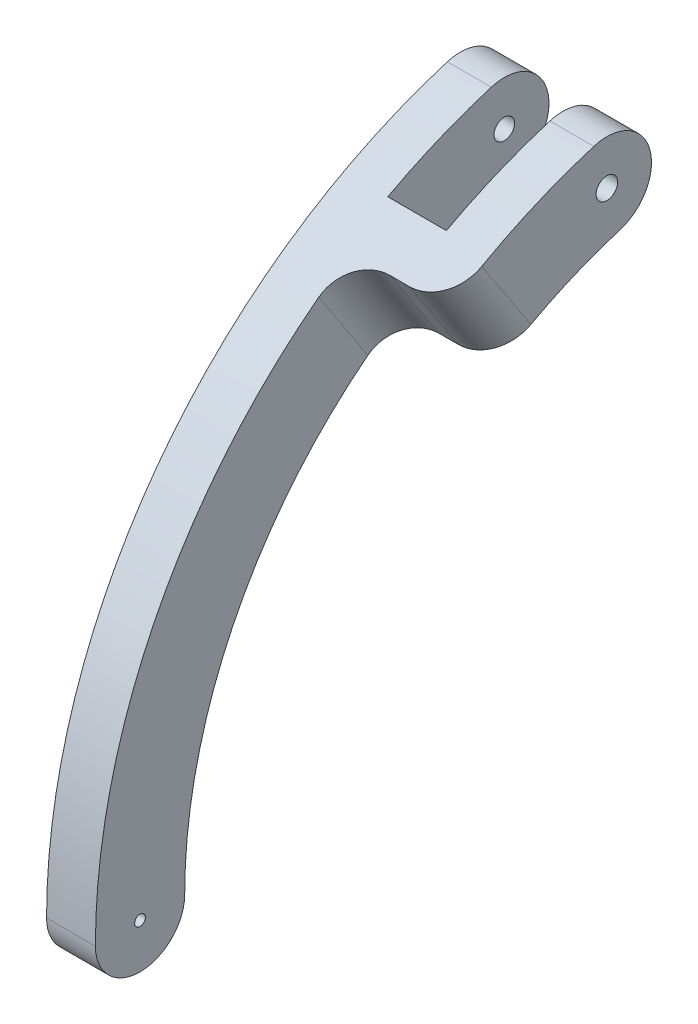
ISO-10303-21;
HEADER;
FILE_DESCRIPTION(('STEP AP214'),'2;1');
FILE_NAME('part.step','',(''),(''),'','','');
FILE_SCHEMA(('AUTOMOTIVE_DESIGN { 1 0 10303 214 1 1 1 1 }'));
ENDSEC;
DATA;
#1=APPLICATION_CONTEXT('core data for automotive mechanical design processes');
#2=APPLICATION_PROTOCOL_DEFINITION('international standard','automotive_design',2000,#1);
#3=PRODUCT_CONTEXT('',#1,'mechanical');
#4=PRODUCT('Part','Part','',(#3));
#5=PRODUCT_RELATED_PRODUCT_CATEGORY('part','',(#4));
#6=PRODUCT_DEFINITION_FORMATION('','',#4);
#7=PRODUCT_DEFINITION_CONTEXT('part definition',#1,'design');
#8=PRODUCT_DEFINITION('design','',#6,#7);
#9=PRODUCT_DEFINITION_SHAPE('','',#8);
#10=(LENGTH_UNIT() NAMED_UNIT(*) SI_UNIT(.MILLI.,.METRE.));
#11=(NAMED_UNIT(*) PLANE_ANGLE_UNIT() SI_UNIT($,.RADIAN.));
#12=(NAMED_UNIT(*) SI_UNIT($,.STERADIAN.) SOLID_ANGLE_UNIT());
#13=UNCERTAINTY_MEASURE_WITH_UNIT(LENGTH_MEASURE(1.E-05),#10,'distance_accuracy_value','');
#14=(GEOMETRIC_REPRESENTATION_CONTEXT(3) GLOBAL_UNCERTAINTY_ASSIGNED_CONTEXT((#13)) GLOBAL_UNIT_ASSIGNED_CONTEXT((#10,
#11,#12)) REPRESENTATION_CONTEXT('',''));
#15=CARTESIAN_POINT('',(0.,0.,0.));
#16=DIRECTION('',(0.,0.,1.));
#17=DIRECTION('',(1.,0.,0.));
#18=AXIS2_PLACEMENT_3D('',#15,#16,#17);
#19=CARTESIAN_POINT('',(5.,51.0253857832654,15.542380952381));
#20=DIRECTION('',(-1.,0.,0.));
#21=DIRECTION('',(0.,0.,1.));
#22=AXIS2_PLACEMENT_3D('',#19,#20,#21);
#23=CYLINDRICAL_SURFACE('',#22,4.572);
#24=DIRECTION('',(-1.,0.,0.));
#25=VECTOR('',#24,1.);
#26=CARTESIAN_POINT('',(5.,55.3989902789739,16.8745850340136));
#27=LINE('',#26,#25);
#28=CARTESIAN_POINT('',(4.5,55.3989902789739,16.8745850340136));
#29=VERTEX_POINT('',#28);
#30=CARTESIAN_POINT('',(0.,55.3989902789739,16.8745850340136));
#31=VERTEX_POINT('',#30);
#32=EDGE_CURVE('E210',#29,#31,#27,.T.);
#33=ORIENTED_EDGE('',*,*,#32,.F.);
#34=CARTESIAN_POINT('',(4.5,51.0253857832654,15.542380952381));
#35=DIRECTION('',(-1.,0.,0.));
#36=DIRECTION('',(0.,0.,1.));
#37=AXIS2_PLACEMENT_3D('',#34,#35,#36);
#38=CIRCLE('',#37,4.572);
#39=CARTESIAN_POINT('',(4.5,46.651781287557,14.2101768707483));
#40=VERTEX_POINT('',#39);
#41=EDGE_CURVE('E158',#29,#40,#38,.T.);
#42=ORIENTED_EDGE('',*,*,#41,.T.);
#43=DIRECTION('',(-1.,0.,0.));
#44=VECTOR('',#43,1.);
#45=CARTESIAN_POINT('',(5.,46.651781287557,14.2101768707483));
#46=LINE('',#45,#44);
#47=CARTESIAN_POINT('',(0.,46.651781287557,14.2101768707483));
#48=VERTEX_POINT('',#47);
#49=EDGE_CURVE('E157',#40,#48,#46,.T.);
#50=ORIENTED_EDGE('',*,*,#49,.T.);
#51=CARTESIAN_POINT('',(0.,51.0253857832654,15.542380952381));
#52=DIRECTION('',(1.,0.,0.));
#53=DIRECTION('',(0.,0.,-1.));
#54=AXIS2_PLACEMENT_3D('',#51,#52,#53);
#55=CIRCLE('',#54,4.572);
#56=EDGE_CURVE('E204',#48,#31,#55,.T.);
#57=ORIENTED_EDGE('',*,*,#56,.T.);
#58=EDGE_LOOP('',(#33,#42,#50,#57));
#59=FACE_BOUND('',#58,.T.);
#60=ADVANCED_FACE('F35',(#59),#23,.T.);
#61=CARTESIAN_POINT('',(5.,0.,26.67));
#62=DIRECTION('',(1.,0.,0.));
#63=DIRECTION('',(0.,0.,-1.));
#64=AXIS2_PLACEMENT_3D('',#61,#62,#63);
#65=PLANE('',#64);
#66=CARTESIAN_POINT('',(5.,0.,0.));
#67=DIRECTION('',(-1.,0.,0.));
#68=DIRECTION('',(0.,0.,1.));
#69=AXIS2_PLACEMENT_3D('',#66,#67,#68);
#70=CIRCLE('',#69,48.768);
#71=CARTESIAN_POINT('',(5.,0.,48.768));
#72=VERTEX_POINT('',#71);
#73=CARTESIAN_POINT('',(5.,38.4411023336171,30.0099895930735));
#74=VERTEX_POINT('',#73);
#75=EDGE_CURVE('E193',#72,#74,#70,.T.);
#76=ORIENTED_EDGE('',*,*,#75,.T.);
#77=DIRECTION('',(0.,-0.836061110184684,-0.548636327667749));
#78=VECTOR('',#77,1.);
#79=CARTESIAN_POINT('',(5.,10.0388102595876,11.3719629811189));
#80=LINE('',#79,#78);
#81=CARTESIAN_POINT('',(5.,46.1077936196312,35.0409918742249));
#82=VERTEX_POINT('',#81);
#83=EDGE_CURVE('E233',#74,#82,#80,.F.);
#84=ORIENTED_EDGE('',*,*,#83,.T.);
#85=CARTESIAN_POINT('',(5.,0.,0.));
#86=DIRECTION('',(1.,0.,0.));
#87=DIRECTION('',(0.,0.,1.));
#88=AXIS2_PLACEMENT_3D('',#85,#86,#87);
#89=CIRCLE('',#88,57.912);
#90=CARTESIAN_POINT('',(5.,0.,57.912));
#91=VERTEX_POINT('',#90);
#92=EDGE_CURVE('E197',#82,#91,#89,.T.);
#93=ORIENTED_EDGE('',*,*,#92,.T.);
#94=CARTESIAN_POINT('',(5.,0.,53.34));
#95=DIRECTION('',(1.,0.,0.));
#96=DIRECTION('',(0.,0.,-1.));
#97=AXIS2_PLACEMENT_3D('',#94,#95,#96);
#98=CIRCLE('',#97,4.572);
#99=EDGE_CURVE('E190',#91,#72,#98,.T.);
#100=ORIENTED_EDGE('',*,*,#99,.T.);
#101=EDGE_LOOP('',(#76,#84,#93,#100));
#102=FACE_BOUND('',#101,.T.);
#103=CARTESIAN_POINT('',(5.,0.,53.34));
#104=DIRECTION('',(1.,0.,0.));
#105=DIRECTION('',(0.,0.,-1.));
#106=AXIS2_PLACEMENT_3D('',#103,#104,#105);
#107=CIRCLE('',#106,0.550000000000003);
#108=CARTESIAN_POINT('',(5.,0.,52.79));
#109=VERTEX_POINT('',#108);
#110=EDGE_CURVE('E181',#109,#109,#107,.T.);
#111=ORIENTED_EDGE('',*,*,#110,.F.);
#112=EDGE_LOOP('',(#111));
#113=FACE_BOUND('',#112,.T.);
#114=ADVANCED_FACE('F272',(#102,#113),#65,.T.);
#115=CARTESIAN_POINT('',(0.,0.,26.67));
#116=DIRECTION('',(1.,0.,0.));
#117=DIRECTION('',(0.,0.,-1.));
#118=AXIS2_PLACEMENT_3D('',#115,#116,#117);
#119=PLANE('',#118);
#120=CARTESIAN_POINT('',(0.,0.,53.34));
#121=DIRECTION('',(1.,0.,0.));
#122=DIRECTION('',(0.,0.,-1.));
#123=AXIS2_PLACEMENT_3D('',#120,#121,#122);
#124=CIRCLE('',#123,4.572);
#125=CARTESIAN_POINT('',(0.,0.,57.912));
#126=VERTEX_POINT('',#125);
#127=CARTESIAN_POINT('',(0.,0.,48.768));
#128=VERTEX_POINT('',#127);
#129=EDGE_CURVE('E189',#126,#128,#124,.T.);
#130=ORIENTED_EDGE('',*,*,#129,.F.);
#131=CARTESIAN_POINT('',(0.,0.,0.));
#132=DIRECTION('',(1.,0.,0.));
#133=DIRECTION('',(0.,0.,1.));
#134=AXIS2_PLACEMENT_3D('',#131,#132,#133);
#135=CIRCLE('',#134,57.912);
#136=EDGE_CURVE('E194',#31,#126,#135,.T.);
#137=ORIENTED_EDGE('',*,*,#136,.F.);
#138=ORIENTED_EDGE('',*,*,#56,.F.);
#139=CARTESIAN_POINT('',(0.,0.,0.));
#140=DIRECTION('',(-1.,0.,0.));
#141=DIRECTION('',(0.,0.,1.));
#142=AXIS2_PLACEMENT_3D('',#139,#140,#141);
#143=CIRCLE('',#142,48.768);
#144=EDGE_CURVE('E202',#128,#48,#143,.T.);
#145=ORIENTED_EDGE('',*,*,#144,.F.);
#146=EDGE_LOOP('',(#130,#137,#138,#145));
#147=FACE_BOUND('',#146,.T.);
#148=CARTESIAN_POINT('',(0.,51.0253857832654,15.542380952381));
#149=DIRECTION('',(1.,0.,0.));
#150=DIRECTION('',(0.,0.,-1.));
#151=AXIS2_PLACEMENT_3D('',#148,#149,#150);
#152=CIRCLE('',#151,1.05);
#153=CARTESIAN_POINT('',(0.,51.0253857832654,14.492380952381));
#154=VERTEX_POINT('',#153);
#155=EDGE_CURVE('E184',#154,#154,#152,.T.);
#156=ORIENTED_EDGE('',*,*,#155,.T.);
#157=EDGE_LOOP('',(#156));
#158=FACE_BOUND('',#157,.T.);
#159=CARTESIAN_POINT('',(0.,0.,53.34));
#160=DIRECTION('',(1.,0.,0.));
#161=DIRECTION('',(0.,0.,-1.));
#162=AXIS2_PLACEMENT_3D('',#159,#160,#161);
#163=CIRCLE('',#162,0.550000000000003);
#164=CARTESIAN_POINT('',(0.,0.,52.79));
#165=VERTEX_POINT('',#164);
#166=EDGE_CURVE('E180',#165,#165,#163,.T.);
#167=ORIENTED_EDGE('',*,*,#166,.T.);
#168=EDGE_LOOP('',(#167));
#169=FACE_BOUND('',#168,.T.);
#170=ADVANCED_FACE('F277',(#147,#158,#169),#119,.F.);
#171=CARTESIAN_POINT('',(5.,0.,53.34));
#172=DIRECTION('',(-1.,0.,0.));
#173=DIRECTION('',(0.,0.,1.));
#174=AXIS2_PLACEMENT_3D('',#171,#172,#173);
#175=CYLINDRICAL_SURFACE('',#174,4.572);
#176=ORIENTED_EDGE('',*,*,#129,.T.);
#177=DIRECTION('',(-1.,0.,0.));
#178=VECTOR('',#177,1.);
#179=CARTESIAN_POINT('',(5.,0.,48.768));
#180=LINE('',#179,#178);
#181=EDGE_CURVE('E217',#72,#128,#180,.T.);
#182=ORIENTED_EDGE('',*,*,#181,.F.);
#183=ORIENTED_EDGE('',*,*,#99,.F.);
#184=DIRECTION('',(-1.,0.,0.));
#185=VECTOR('',#184,1.);
#186=CARTESIAN_POINT('',(5.,0.,57.912));
#187=LINE('',#186,#185);
#188=EDGE_CURVE('E199',#91,#126,#187,.T.);
#189=ORIENTED_EDGE('',*,*,#188,.T.);
#190=EDGE_LOOP('',(#176,#182,#183,#189));
#191=FACE_BOUND('',#190,.T.);
#192=ADVANCED_FACE('F252',(#191),#175,.T.);
#193=CARTESIAN_POINT('',(5.,0.,0.));
#194=DIRECTION('',(-1.,0.,0.));
#195=DIRECTION('',(0.,0.,1.));
#196=AXIS2_PLACEMENT_3D('',#193,#194,#195);
#197=CYLINDRICAL_SURFACE('',#196,48.768);
#198=CARTESIAN_POINT('',(15.,0.,0.));
#199=DIRECTION('',(-1.,0.,0.));
#200=DIRECTION('',(0.,0.,-1.));
#201=AXIS2_PLACEMENT_3D('',#198,#199,#200);
#202=CIRCLE('',#201,48.768);
#203=CARTESIAN_POINT('',(15.,42.8301929549591,23.321500711596));
#204=VERTEX_POINT('',#203);
#205=CARTESIAN_POINT('',(15.,46.651781287557,14.2101768707483));
#206=VERTEX_POINT('',#205);
#207=EDGE_CURVE('E172',#204,#206,#202,.T.);
#208=ORIENTED_EDGE('',*,*,#207,.F.);
#209=CARTESIAN_POINT('',(15.,42.8301929549591,23.321500711596));
#210=CARTESIAN_POINT('',(15.0000121815658,42.7764127888601,23.4202767277682));
#211=CARTESIAN_POINT('',(14.9952890331577,42.7222844230492,23.5188626327073));
#212=CARTESIAN_POINT('',(14.9764431928033,42.6137373798137,23.7149671809633));
#213=CARTESIAN_POINT('',(14.9623207454146,42.559318709979,23.8124858519811));
#214=CARTESIAN_POINT('',(14.9247607016469,42.4506327478518,24.0057057629585));
#215=CARTESIAN_POINT('',(14.901329699486,42.3963653757259,24.1014082393398));
#216=CARTESIAN_POINT('',(14.8453102615447,42.2883671251319,24.2904028164442));
#217=CARTESIAN_POINT('',(14.8127220017254,42.2346362363757,24.3836949634453));
#218=CARTESIAN_POINT('',(14.7385919086943,42.128118448252,24.5672694604092));
#219=CARTESIAN_POINT('',(14.697046366619,42.0753319497547,24.6575505456736));
#220=CARTESIAN_POINT('',(14.6052829373853,41.9711439921967,24.8344809113444));
#221=CARTESIAN_POINT('',(14.5550618462363,41.9197430529771,24.9211288352337));
#222=CARTESIAN_POINT('',(14.446333868917,41.81880837762,25.0901329028123));
#223=CARTESIAN_POINT('',(14.3878318015586,41.7692735766287,25.172491504655));
#224=CARTESIAN_POINT('',(14.2629404081728,41.6724651792581,25.3324342888501));
#225=CARTESIAN_POINT('',(14.1965481847884,41.6251924225214,25.4100167013565));
#226=CARTESIAN_POINT('',(13.9865037549123,41.4876069199725,25.6344878980303));
#227=CARTESIAN_POINT('',(13.8316701703922,41.4012355607191,25.7735864060066));
#228=CARTESIAN_POINT('',(13.4967874547993,41.2423734941752,26.0270427257262));
#229=CARTESIAN_POINT('',(13.3167330656486,41.1698856888318,26.1413953657233));
#230=CARTESIAN_POINT('',(12.9362943477481,41.0413763435968,26.3426945197453));
#231=CARTESIAN_POINT('',(12.7358907287593,40.9853706278016,26.429614702222));
#232=CARTESIAN_POINT('',(12.3206250923403,40.8920825254445,26.5737244480186));
#233=CARTESIAN_POINT('',(12.1057713832712,40.8547894822874,26.6309309335112));
#234=CARTESIAN_POINT('',(11.7413783347004,40.809467770877,26.7003044230343));
#235=CARTESIAN_POINT('',(11.5941057344009,40.7958188492692,26.7211426356511));
#236=CARTESIAN_POINT('',(11.2979090454556,40.7775963062787,26.7489353184245));
#237=CARTESIAN_POINT('',(11.1489875421299,40.7730100737746,26.7559090816406));
#238=CARTESIAN_POINT('',(11.,40.7730282214867,26.7558964277008));
#239=B_SPLINE_CURVE_WITH_KNOTS('',3,(#209,#210,#211,#212,#213,#214,#215,#216,#217,#218,#219,
#220,#221,#222,#223,#224,#225,#226,#227,#228,#229,#230,#231,#232,#233,#234,#235,#236,#237,#238),
.UNSPECIFIED.,.F.,.F.,(4,2,2,2,2,2,2,2,2,2,2,2,2,2,4),(0.,0.337303006389539,0.674597236935861,
1.01165295173073,1.34870219028153,1.68589125680822,2.02320511882105,2.36032349417541,
2.69756604806973,3.37013327016325,4.04284091953263,4.71619232956495,5.38915983930082,
5.83638325715429,6.28298390492815),.UNSPECIFIED.);
#240=CARTESIAN_POINT('',(11.,40.7730282214867,26.7558964277008));
#241=VERTEX_POINT('',#240);
#242=EDGE_CURVE('E56',#204,#241,#239,.T.);
#243=ORIENTED_EDGE('',*,*,#242,.T.);
#244=DIRECTION('',(-1.,0.,0.));
#245=VECTOR('',#244,1.);
#246=CARTESIAN_POINT('',(15.,40.7730282214867,26.7558964277008));
#247=LINE('',#246,#245);
#248=CARTESIAN_POINT('',(9.,40.7730282214867,26.7558964277008));
#249=VERTEX_POINT('',#248);
#250=EDGE_CURVE('E174',#241,#249,#247,.T.);
#251=ORIENTED_EDGE('',*,*,#250,.T.);
#252=CARTESIAN_POINT('',(9.,40.7730282214867,26.7558964277008));
#253=CARTESIAN_POINT('',(8.88750101249402,40.7730317096793,26.7558858272302));
#254=CARTESIAN_POINT('',(8.77500713511228,40.7704243466639,26.7598643070856));
#255=CARTESIAN_POINT('',(8.55082411767978,40.7600160369833,26.775718129916));
#256=CARTESIAN_POINT('',(8.43913493951237,40.7522153379706,26.7875930963344));
#257=CARTESIAN_POINT('',(8.21742744147297,40.7314561932013,26.8191468700817));
#258=CARTESIAN_POINT('',(8.1074079406166,40.7185015880605,26.8388198663922));
#259=CARTESIAN_POINT('',(7.88977104553745,40.6875048637736,26.8857872477433));
#260=CARTESIAN_POINT('',(7.78215362199694,40.6694628067572,26.9130815397097));
#261=CARTESIAN_POINT('',(7.46394202035902,40.6077853893746,27.00613301235));
#262=CARTESIAN_POINT('',(7.25789909730264,40.5565904317826,27.0830716264149));
#263=CARTESIAN_POINT('',(6.86440634060854,40.4350900355563,27.2641361317215));
#264=CARTESIAN_POINT('',(6.67695325928813,40.3647879430329,27.3682572625364));
#265=CARTESIAN_POINT('',(6.32582716859217,40.2064630711044,27.6003229087612));
#266=CARTESIAN_POINT('',(6.16214725136029,40.1184454571707,27.7282604789863));
#267=CARTESIAN_POINT('',(5.8631693304621,39.9265174174691,28.0039134816577));
#268=CARTESIAN_POINT('',(5.7278760790381,39.8226043356507,28.15163221892));
#269=CARTESIAN_POINT('',(5.48965473540508,39.6013691560713,28.4620033372705));
#270=CARTESIAN_POINT('',(5.38669463298308,39.4840604780543,28.6246407412128));
#271=CARTESIAN_POINT('',(5.21587512446005,39.2387896166409,28.9599419978752));
#272=CARTESIAN_POINT('',(5.14799679932643,39.1108332187054,29.132600390439));
#273=CARTESIAN_POINT('',(5.06578855642458,38.8920200048178,29.4236253642593));
#274=CARTESIAN_POINT('',(5.04112371099703,38.8031798670384,29.5406956153022));
#275=CARTESIAN_POINT('',(5.00823113872103,38.6234550851084,29.7753013450045));
#276=CARTESIAN_POINT('',(4.99997966558717,38.53257358726,29.8928359046975));
#277=CARTESIAN_POINT('',(5.,38.4411023336171,30.0099895930735));
#278=B_SPLINE_CURVE_WITH_KNOTS('',3,(#252,#253,#254,#255,#256,#257,#258,#259,#260,#261,#262,
#263,#264,#265,#266,#267,#268,#269,#270,#271,#272,#273,#274,#275,#276,#277),.UNSPECIFIED.,.F.,
.F.,(4,2,2,2,2,2,2,2,2,2,2,2,4),(0.,0.337387217395278,0.674758347103189,1.01187854224819,
1.34899462053765,2.02295805769869,2.69680354390322,3.37045283491373,4.04421481245246,
4.71730763905991,5.39003709788675,5.83622991594024,6.28177672715104),.UNSPECIFIED.);
#279=EDGE_CURVE('E49',#249,#74,#278,.T.);
#280=ORIENTED_EDGE('',*,*,#279,.T.);
#281=ORIENTED_EDGE('',*,*,#75,.F.);
#282=ORIENTED_EDGE('',*,*,#181,.T.);
#283=ORIENTED_EDGE('',*,*,#144,.T.);
#284=ORIENTED_EDGE('',*,*,#49,.F.);
#285=CARTESIAN_POINT('',(4.50000000000001,0.,0.));
#286=DIRECTION('',(-1.,0.,0.));
#287=DIRECTION('',(0.,0.,1.));
#288=AXIS2_PLACEMENT_3D('',#285,#286,#287);
#289=CIRCLE('',#288,48.768);
#290=CARTESIAN_POINT('',(4.5,43.3013482124218,22.4345953158642));
#291=VERTEX_POINT('',#290);
#292=EDGE_CURVE('E143',#40,#291,#289,.F.);
#293=ORIENTED_EDGE('',*,*,#292,.T.);
#294=DIRECTION('',(-1.,0.,0.));
#295=VECTOR('',#294,1.);
#296=CARTESIAN_POINT('',(5.,43.3013482124218,22.4345953158642));
#297=LINE('',#296,#295);
#298=CARTESIAN_POINT('',(10.5,43.3013482124218,22.4345953158642));
#299=VERTEX_POINT('',#298);
#300=EDGE_CURVE('E132',#291,#299,#297,.F.);
#301=ORIENTED_EDGE('',*,*,#300,.T.);
#302=CARTESIAN_POINT('',(10.5,0.,0.));
#303=DIRECTION('',(1.,0.,0.));
#304=DIRECTION('',(0.,0.,-1.));
#305=AXIS2_PLACEMENT_3D('',#302,#303,#304);
#306=CIRCLE('',#305,48.768);
#307=CARTESIAN_POINT('',(10.5,46.651781287557,14.2101768707483));
#308=VERTEX_POINT('',#307);
#309=EDGE_CURVE('E165',#299,#308,#306,.F.);
#310=ORIENTED_EDGE('',*,*,#309,.T.);
#311=EDGE_CURVE('E214',#206,#308,#46,.T.);
#312=ORIENTED_EDGE('',*,*,#311,.F.);
#313=EDGE_LOOP('',(#208,#243,#251,#280,#281,#282,#283,#284,#293,#301,#310,#312));
#314=FACE_BOUND('',#313,.T.);
#315=ADVANCED_FACE('F155',(#314),#197,.F.);
#316=ORIENTED_EDGE('',*,*,#311,.T.);
#317=CARTESIAN_POINT('',(10.5,51.0253857832654,15.542380952381));
#318=DIRECTION('',(1.,0.,0.));
#319=DIRECTION('',(0.,0.,-1.));
#320=AXIS2_PLACEMENT_3D('',#317,#318,#319);
#321=CIRCLE('',#320,4.572);
#322=CARTESIAN_POINT('',(10.5,55.3989902789739,16.8745850340136));
#323=VERTEX_POINT('',#322);
#324=EDGE_CURVE('E142',#308,#323,#321,.T.);
#325=ORIENTED_EDGE('',*,*,#324,.T.);
#326=CARTESIAN_POINT('',(15.,55.3989902789739,16.8745850340136));
#327=VERTEX_POINT('',#326);
#328=EDGE_CURVE('E211',#327,#323,#27,.T.);
#329=ORIENTED_EDGE('',*,*,#328,.F.);
#330=CARTESIAN_POINT('',(15.,51.0253857832654,15.542380952381));
#331=DIRECTION('',(1.,0.,0.));
#332=DIRECTION('',(0.,0.,-1.));
#333=AXIS2_PLACEMENT_3D('',#330,#331,#332);
#334=CIRCLE('',#333,4.572);
#335=EDGE_CURVE('E167',#206,#327,#334,.T.);
#336=ORIENTED_EDGE('',*,*,#335,.F.);
#337=EDGE_LOOP('',(#316,#325,#329,#336));
#338=FACE_BOUND('',#337,.T.);
#339=ADVANCED_FACE('F251',(#338),#23,.T.);
#340=CARTESIAN_POINT('',(5.,0.,0.));
#341=DIRECTION('',(-1.,0.,0.));
#342=DIRECTION('',(0.,0.,1.));
#343=AXIS2_PLACEMENT_3D('',#340,#341,#342);
#344=CYLINDRICAL_SURFACE('',#343,57.912);
#345=DIRECTION('',(-1.,0.,0.));
#346=VECTOR('',#345,1.);
#347=CARTESIAN_POINT('',(15.,48.4179710130154,31.7726270078947));
#348=LINE('',#347,#346);
#349=CARTESIAN_POINT('',(11.,48.4179710130154,31.7726270078947));
#350=VERTEX_POINT('',#349);
#351=CARTESIAN_POINT('',(9.,48.4179710130154,31.7726270078947));
#352=VERTEX_POINT('',#351);
#353=EDGE_CURVE('E177',#350,#352,#348,.T.);
#354=ORIENTED_EDGE('',*,*,#353,.F.);
#355=CARTESIAN_POINT('',(11.,48.4179710130154,31.7726270078947));
#356=CARTESIAN_POINT('',(11.112501163972,48.4179630585636,31.7726346788464));
#357=CARTESIAN_POINT('',(11.2249972179525,48.4205748719332,31.7686588985594));
#358=CARTESIAN_POINT('',(11.4491845330179,48.4309774232356,31.7528004206076));
#359=CARTESIAN_POINT('',(11.5608758322876,48.4387679137878,31.7409181006309));
#360=CARTESIAN_POINT('',(11.7825871052944,48.45945948631,31.7093183271866));
#361=CARTESIAN_POINT('',(11.892608265428,48.4723567454999,31.6896067344532));
#362=CARTESIAN_POINT('',(12.1102483755836,48.5031278866428,31.6424890493224));
#363=CARTESIAN_POINT('',(12.217867354921,48.5210017078275,31.6150830508804));
#364=CARTESIAN_POINT('',(12.5360832101477,48.5818884331414,31.5215083884526));
#365=CARTESIAN_POINT('',(12.7421286619525,48.632175066843,31.4439702469302));
#366=CARTESIAN_POINT('',(13.1356266105201,48.7502246241275,31.2606325064378));
#367=CARTESIAN_POINT('',(13.3230823607317,48.81798448216,31.1548378647494));
#368=CARTESIAN_POINT('',(13.6742306327616,48.9685457968564,30.9176477630495));
#369=CARTESIAN_POINT('',(13.8379281209202,49.0513441017673,30.7862576669073));
#370=CARTESIAN_POINT('',(14.136942447241,49.229090721021,30.5012215358213));
#371=CARTESIAN_POINT('',(14.2722542992767,49.3240411652596,30.347571598788));
#372=CARTESIAN_POINT('',(14.5105519675734,49.5227547711463,30.022204855704));
#373=CARTESIAN_POINT('',(14.6135586704662,49.6265121833456,29.8504998193316));
#374=CARTESIAN_POINT('',(14.7844322419224,49.8394626278524,29.4935717559061));
#375=CARTESIAN_POINT('',(14.8523185278,49.9486526199195,29.308356263263));
#376=CARTESIAN_POINT('',(14.9344002102592,50.1316237910568,28.9938109450065));
#377=CARTESIAN_POINT('',(14.9589916442603,50.2048784485315,28.8667883401954));
#378=CARTESIAN_POINT('',(14.9917897054698,50.3512100351922,28.6107902820034));
#379=CARTESIAN_POINT('',(15.0000198742641,50.4242870684093,28.4818179038994));
#380=CARTESIAN_POINT('',(15.,50.4968842409732,28.3525029927474));
#381=B_SPLINE_CURVE_WITH_KNOTS('',3,(#355,#356,#357,#358,#359,#360,#361,#362,#363,#364,#365,
#366,#367,#368,#369,#370,#371,#372,#373,#374,#375,#376,#377,#378,#379,#380),.UNSPECIFIED.,.F.,
.F.,(4,2,2,2,2,2,2,2,2,2,2,2,4),(0.,0.337393741367434,0.674771366907488,1.01189691726987,
1.34901835121017,2.02299176397614,2.69684701334693,3.37056119896843,4.04439362807238,
4.71778949385368,5.39081265476301,5.83599703438905,6.28054039062029),.UNSPECIFIED.);
#382=CARTESIAN_POINT('',(15.,50.4968842409732,28.3525029927474));
#383=VERTEX_POINT('',#382);
#384=EDGE_CURVE('E64',#350,#383,#381,.T.);
#385=ORIENTED_EDGE('',*,*,#384,.T.);
#386=CARTESIAN_POINT('',(15.,0.,0.));
#387=DIRECTION('',(1.,0.,0.));
#388=DIRECTION('',(0.,0.,-1.));
#389=AXIS2_PLACEMENT_3D('',#386,#387,#388);
#390=CIRCLE('',#389,57.912);
#391=EDGE_CURVE('E170',#327,#383,#390,.T.);
#392=ORIENTED_EDGE('',*,*,#391,.F.);
#393=ORIENTED_EDGE('',*,*,#328,.T.);
#394=CARTESIAN_POINT('',(10.5,0.,0.));
#395=DIRECTION('',(1.,0.,0.));
#396=DIRECTION('',(0.,0.,-1.));
#397=AXIS2_PLACEMENT_3D('',#394,#395,#396);
#398=CIRCLE('',#397,57.912);
#399=CARTESIAN_POINT('',(10.5,50.9803557110197,27.4736796876193));
#400=VERTEX_POINT('',#399);
#401=EDGE_CURVE('E225',#323,#400,#398,.T.);
#402=ORIENTED_EDGE('',*,*,#401,.T.);
#403=DIRECTION('',(-1.,0.,0.));
#404=VECTOR('',#403,1.);
#405=CARTESIAN_POINT('',(5.,50.9803557110197,27.4736796876193));
#406=LINE('',#405,#404);
#407=CARTESIAN_POINT('',(4.49999999999998,50.9803557110197,27.4736796876193));
#408=VERTEX_POINT('',#407);
#409=EDGE_CURVE('E220',#400,#408,#406,.T.);
#410=ORIENTED_EDGE('',*,*,#409,.T.);
#411=CARTESIAN_POINT('',(4.50000000000001,0.,0.));
#412=DIRECTION('',(-1.,0.,0.));
#413=DIRECTION('',(0.,0.,1.));
#414=AXIS2_PLACEMENT_3D('',#411,#412,#413);
#415=CIRCLE('',#414,57.912);
#416=EDGE_CURVE('E149',#408,#29,#415,.T.);
#417=ORIENTED_EDGE('',*,*,#416,.T.);
#418=ORIENTED_EDGE('',*,*,#32,.T.);
#419=ORIENTED_EDGE('',*,*,#136,.T.);
#420=ORIENTED_EDGE('',*,*,#188,.F.);
#421=ORIENTED_EDGE('',*,*,#92,.F.);
#422=CARTESIAN_POINT('',(5.,46.1077936196312,35.0409918742249));
#423=CARTESIAN_POINT('',(4.99998784504616,46.1758538799864,34.9514419545644));
#424=CARTESIAN_POINT('',(5.00472113548672,46.2436475980303,34.8616905052859));
#425=CARTESIAN_POINT('',(5.02360278190742,46.378237564617,34.682434803213));
#426=CARTESIAN_POINT('',(5.03775083301796,46.4450338453873,34.5929305425083));
#427=CARTESIAN_POINT('',(5.07537261290226,46.577121370985,34.4148778206176));
#428=CARTESIAN_POINT('',(5.09883960847792,46.6424136665258,34.3263287166485));
#429=CARTESIAN_POINT('',(5.15493755572512,46.7711049005316,34.1507734776071));
#430=CARTESIAN_POINT('',(5.18756834992342,46.8345038715115,34.0637673160477));
#431=CARTESIAN_POINT('',(5.26178547366234,46.9590182147607,33.8919108179806));
#432=CARTESIAN_POINT('',(5.30337522164879,47.0201327048713,33.80706131824));
#433=CARTESIAN_POINT('',(5.395227155145,47.1396830544936,33.6401630291409));
#434=CARTESIAN_POINT('',(5.44549254351428,47.1981179146238,33.5581152875787));
#435=CARTESIAN_POINT('',(5.55430803276902,47.3118921753681,33.3975190467258));
#436=CARTESIAN_POINT('',(5.61285339889076,47.3672333200094,33.3189685810976));
#437=CARTESIAN_POINT('',(5.73782896225119,47.4745264837964,33.1659137105205));
#438=CARTESIAN_POINT('',(5.80426205587684,47.5264772470694,33.0914108065713));
#439=CARTESIAN_POINT('',(6.01449629495432,47.6765993166961,32.8751016724606));
#440=CARTESIAN_POINT('',(6.16948982217843,47.7693083233371,32.7401155428507));
#441=CARTESIAN_POINT('',(6.5047032508956,47.9377861875492,32.4929361743943));
#442=CARTESIAN_POINT('',(6.68492831650911,48.013551569015,32.3807476130615));
#443=CARTESIAN_POINT('',(7.06567001695441,48.1466206926253,32.182556567128));
#444=CARTESIAN_POINT('',(7.26620151354893,48.2039107829651,32.0965734488784));
#445=CARTESIAN_POINT('',(7.68171103742188,48.2987379880601,31.9537017738913));
#446=CARTESIAN_POINT('',(7.89668069210157,48.3362864412213,31.8967965171122));
#447=CARTESIAN_POINT('',(8.26077497761218,48.3816924944307,31.8278597096963));
#448=CARTESIAN_POINT('',(8.40762704336474,48.3952942398052,31.8071644250548));
#449=CARTESIAN_POINT('',(8.70296578724104,48.413429816255,31.7795474193811));
#450=CARTESIAN_POINT('',(8.85144988754818,48.4179763225003,31.7726064456707));
#451=CARTESIAN_POINT('',(9.,48.4179710130154,31.7726270078947));
#452=B_SPLINE_CURVE_WITH_KNOTS('',3,(#422,#423,#424,#425,#426,#427,#428,#429,#430,#431,#432,
#433,#434,#435,#436,#437,#438,#439,#440,#441,#442,#443,#444,#445,#446,#447,#448,#449,#450,#451),
.UNSPECIFIED.,.F.,.F.,(4,2,2,2,2,2,2,2,2,2,2,2,2,2,4),(0.,0.337333980761031,0.674657038475074,
1.011736813005,1.34881079541763,1.68601362286157,2.02334120564663,2.36047666754039,
2.69773631125885,3.37068246374086,4.04376654952026,4.7173468585567,5.39053987989485,
5.83645491290623,6.28174533157018),.UNSPECIFIED.);
#453=EDGE_CURVE('E11',#82,#352,#452,.T.);
#454=ORIENTED_EDGE('',*,*,#453,.T.);
#455=EDGE_LOOP('',(#354,#385,#392,#393,#402,#410,#417,#418,#419,#420,#421,#454));
#456=FACE_BOUND('',#455,.T.);
#457=ADVANCED_FACE('F282',(#456),#344,.T.);
#458=CARTESIAN_POINT('',(5.,51.0253857832654,15.542380952381));
#459=DIRECTION('',(-1.,0.,0.));
#460=DIRECTION('',(0.,0.,1.));
#461=AXIS2_PLACEMENT_3D('',#458,#459,#460);
#462=CYLINDRICAL_SURFACE('',#461,1.05);
#463=CARTESIAN_POINT('',(4.5,51.0253857832654,15.542380952381));
#464=DIRECTION('',(-1.,0.,0.));
#465=DIRECTION('',(0.,0.,1.));
#466=AXIS2_PLACEMENT_3D('',#463,#464,#465);
#467=CIRCLE('',#466,1.05);
#468=CARTESIAN_POINT('',(4.5,51.0253857832654,16.592380952381));
#469=VERTEX_POINT('',#468);
#470=EDGE_CURVE('E221',#469,#469,#467,.T.);
#471=ORIENTED_EDGE('',*,*,#470,.F.);
#472=EDGE_LOOP('',(#471));
#473=FACE_BOUND('',#472,.T.);
#474=ORIENTED_EDGE('',*,*,#155,.F.);
#475=EDGE_LOOP('',(#474));
#476=FACE_BOUND('',#475,.T.);
#477=ADVANCED_FACE('F287',(#473,#476),#462,.F.);
#478=CARTESIAN_POINT('',(5.,0.,53.34));
#479=DIRECTION('',(-1.,0.,0.));
#480=DIRECTION('',(0.,0.,1.));
#481=AXIS2_PLACEMENT_3D('',#478,#479,#480);
#482=CYLINDRICAL_SURFACE('',#481,0.550000000000003);
#483=ORIENTED_EDGE('',*,*,#110,.T.);
#484=EDGE_LOOP('',(#483));
#485=FACE_BOUND('',#484,.T.);
#486=ORIENTED_EDGE('',*,*,#166,.F.);
#487=EDGE_LOOP('',(#486));
#488=FACE_BOUND('',#487,.T.);
#489=ADVANCED_FACE('F330',(#485,#488),#482,.F.);
#490=CARTESIAN_POINT('',(15.,51.0253857832654,15.542380952381));
#491=DIRECTION('',(1.,0.,0.));
#492=DIRECTION('',(0.,0.,-1.));
#493=AXIS2_PLACEMENT_3D('',#490,#491,#492);
#494=PLANE('',#493);
#495=CARTESIAN_POINT('',(15.,51.0253857832729,15.5423809523792));
#496=DIRECTION('',(1.,0.,0.));
#497=DIRECTION('',(0.,0.,-1.));
#498=AXIS2_PLACEMENT_3D('',#495,#496,#497);
#499=CIRCLE('',#498,1.10000000000035);
#500=CARTESIAN_POINT('',(15.,51.0253857832729,14.4423809523789));
#501=VERTEX_POINT('',#500);
#502=EDGE_CURVE('E151',#501,#501,#499,.T.);
#503=ORIENTED_EDGE('',*,*,#502,.F.);
#504=EDGE_LOOP('',(#503));
#505=FACE_BOUND('',#504,.T.);
#506=ORIENTED_EDGE('',*,*,#391,.T.);
#507=DIRECTION('',(0.,-0.836061110184684,-0.548636327667749));
#508=VECTOR('',#507,1.);
#509=CARTESIAN_POINT('',(15.,42.9675735321577,23.411651986962));
#510=LINE('',#509,#508);
#511=EDGE_CURVE('E235',#383,#204,#510,.T.);
#512=ORIENTED_EDGE('',*,*,#511,.T.);
#513=ORIENTED_EDGE('',*,*,#207,.T.);
#514=ORIENTED_EDGE('',*,*,#335,.T.);
#515=EDGE_LOOP('',(#506,#512,#513,#514));
#516=FACE_BOUND('',#515,.T.);
#517=ADVANCED_FACE('F293',(#505,#516),#494,.T.);
#518=CARTESIAN_POINT('',(15.,48.4179710130154,31.7726270078947));
#519=DIRECTION('',(0.,0.548636327667749,-0.836061110184684));
#520=DIRECTION('',(0.,0.836061110184684,0.548636327667749));
#521=AXIS2_PLACEMENT_3D('',#518,#519,#520);
#522=PLANE('',#521);
#523=ORIENTED_EDGE('',*,*,#353,.T.);
#524=DIRECTION('',(0.,-0.836061110184684,-0.548636327667749));
#525=VECTOR('',#524,1.);
#526=CARTESIAN_POINT('',(9.,48.4179710130154,31.7726270078947));
#527=LINE('',#526,#525);
#528=EDGE_CURVE('E230',#352,#249,#527,.T.);
#529=ORIENTED_EDGE('',*,*,#528,.T.);
#530=ORIENTED_EDGE('',*,*,#250,.F.);
#531=DIRECTION('',(0.,-0.836061110184684,-0.548636327667749));
#532=VECTOR('',#531,1.);
#533=CARTESIAN_POINT('',(11.,48.4179710130154,31.7726270078947));
#534=LINE('',#533,#532);
#535=EDGE_CURVE('E228',#241,#350,#534,.F.);
#536=ORIENTED_EDGE('',*,*,#535,.T.);
#537=EDGE_LOOP('',(#523,#529,#530,#536));
#538=FACE_BOUND('',#537,.T.);
#539=ADVANCED_FACE('F296',(#538),#522,.F.);
#540=CARTESIAN_POINT('',(10.5,13.3955830456882,-16.4102292459484));
#541=DIRECTION('',(1.,0.,0.));
#542=DIRECTION('',(0.,0.,-1.));
#543=AXIS2_PLACEMENT_3D('',#540,#541,#542);
#544=PLANE('',#543);
#545=CARTESIAN_POINT('',(10.5,51.0253857832729,15.5423809523792));
#546=DIRECTION('',(-1.,0.,0.));
#547=DIRECTION('',(0.,0.,1.));
#548=AXIS2_PLACEMENT_3D('',#545,#546,#547);
#549=CIRCLE('',#548,1.10000000000035);
#550=CARTESIAN_POINT('',(10.5,51.0253857832729,16.6423809523796));
#551=VERTEX_POINT('',#550);
#552=EDGE_CURVE('E314',#551,#551,#549,.T.);
#553=ORIENTED_EDGE('',*,*,#552,.F.);
#554=EDGE_LOOP('',(#553));
#555=FACE_BOUND('',#554,.T.);
#556=DIRECTION('',(0.,0.836061110184684,0.548636327667749));
#557=VECTOR('',#556,1.);
#558=CARTESIAN_POINT('',(10.5,4.57940436418375,-2.97534758694742));
#559=LINE('',#558,#557);
#560=EDGE_CURVE('E138',#299,#400,#559,.T.);
#561=ORIENTED_EDGE('',*,*,#560,.T.);
#562=ORIENTED_EDGE('',*,*,#401,.F.);
#563=ORIENTED_EDGE('',*,*,#324,.F.);
#564=ORIENTED_EDGE('',*,*,#309,.F.);
#565=EDGE_LOOP('',(#561,#562,#563,#564));
#566=FACE_BOUND('',#565,.T.);
#567=ADVANCED_FACE('F291',(#555,#566),#544,.F.);
#568=CARTESIAN_POINT('',(4.50000000000001,4.57940436418375,-2.97534758694742));
#569=DIRECTION('',(0.,-0.548636327667749,0.836061110184684));
#570=DIRECTION('',(0.,-0.836061110184684,-0.548636327667749));
#571=AXIS2_PLACEMENT_3D('',#568,#569,#570);
#572=PLANE('',#571);
#573=DIRECTION('',(0.,0.836061110184684,0.548636327667749));
#574=VECTOR('',#573,1.);
#575=CARTESIAN_POINT('',(4.50000000000001,4.57940436418375,-2.97534758694742));
#576=LINE('',#575,#574);
#577=EDGE_CURVE('E135',#291,#408,#576,.T.);
#578=ORIENTED_EDGE('',*,*,#577,.T.);
#579=ORIENTED_EDGE('',*,*,#409,.F.);
#580=ORIENTED_EDGE('',*,*,#560,.F.);
#581=ORIENTED_EDGE('',*,*,#300,.F.);
#582=EDGE_LOOP('',(#578,#579,#580,#581));
#583=FACE_BOUND('',#582,.T.);
#584=ADVANCED_FACE('F134',(#583),#572,.F.);
#585=CARTESIAN_POINT('',(4.50000000000003,13.3955830456882,-16.4102292459484));
#586=DIRECTION('',(-1.,0.,0.));
#587=DIRECTION('',(0.,0.,1.));
#588=AXIS2_PLACEMENT_3D('',#585,#586,#587);
#589=PLANE('',#588);
#590=ORIENTED_EDGE('',*,*,#470,.T.);
#591=EDGE_LOOP('',(#590));
#592=FACE_BOUND('',#591,.T.);
#593=ORIENTED_EDGE('',*,*,#41,.F.);
#594=ORIENTED_EDGE('',*,*,#416,.F.);
#595=ORIENTED_EDGE('',*,*,#577,.F.);
#596=ORIENTED_EDGE('',*,*,#292,.F.);
#597=EDGE_LOOP('',(#593,#594,#595,#596));
#598=FACE_BOUND('',#597,.T.);
#599=ADVANCED_FACE('F146',(#592,#598),#589,.F.);
#600=CARTESIAN_POINT('',(9.,46.2234257023444,35.1168714486334));
#601=DIRECTION('',(0.,-0.836061110184684,-0.548636327667749));
#602=DIRECTION('',(0.,0.548636327667749,-0.836061110184684));
#603=AXIS2_PLACEMENT_3D('',#600,#601,#602);
#604=CYLINDRICAL_SURFACE('',#603,4.);
#605=ORIENTED_EDGE('',*,*,#453,.F.);
#606=ORIENTED_EDGE('',*,*,#83,.F.);
#607=ORIENTED_EDGE('',*,*,#279,.F.);
#608=ORIENTED_EDGE('',*,*,#528,.F.);
#609=EDGE_LOOP('',(#605,#606,#607,#608));
#610=FACE_BOUND('',#609,.T.);
#611=ADVANCED_FACE('F258',(#610),#604,.F.);
#612=CARTESIAN_POINT('',(11.,44.9903861789202,24.7390531644125));
#613=DIRECTION('',(0.,0.836061110184684,0.548636327667749));
#614=DIRECTION('',(0.,-0.548636327667749,0.836061110184684));
#615=AXIS2_PLACEMENT_3D('',#612,#613,#614);
#616=CYLINDRICAL_SURFACE('',#615,4.);
#617=ORIENTED_EDGE('',*,*,#384,.F.);
#618=ORIENTED_EDGE('',*,*,#535,.F.);
#619=ORIENTED_EDGE('',*,*,#242,.F.);
#620=ORIENTED_EDGE('',*,*,#511,.F.);
#621=EDGE_LOOP('',(#617,#618,#619,#620));
#622=FACE_BOUND('',#621,.T.);
#623=ADVANCED_FACE('F37',(#622),#616,.T.);
#624=CARTESIAN_POINT('',(15.2258477564665,51.0253857832729,15.5423809523792));
#625=DIRECTION('',(-1.,0.,0.));
#626=DIRECTION('',(0.,0.,1.));
#627=AXIS2_PLACEMENT_3D('',#624,#625,#626);
#628=CYLINDRICAL_SURFACE('',#627,1.10000000000035);
#629=ORIENTED_EDGE('',*,*,#502,.T.);
#630=EDGE_LOOP('',(#629));
#631=FACE_BOUND('',#630,.T.);
#632=ORIENTED_EDGE('',*,*,#552,.T.);
#633=EDGE_LOOP('',(#632));
#634=FACE_BOUND('',#633,.T.);
#635=ADVANCED_FACE('F267',(#631,#634),#628,.F.);
#636=CLOSED_SHELL('',(#60,#114,#170,#192,#315,#339,#457,#477,#489,#517,#539,#567,#584,#599,#611,
#623,#635));
#637=MANIFOLD_SOLID_BREP('B2',#636);
#638=ADVANCED_BREP_SHAPE_REPRESENTATION('',(#18,#637),#14);
#639=SHAPE_DEFINITION_REPRESENTATION(#9,#638);
ENDSEC;
END-ISO-10303-21;
